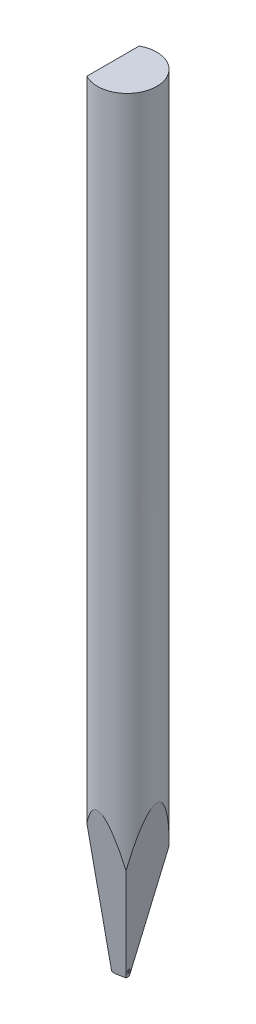
ISO-10303-21;
HEADER;
FILE_DESCRIPTION(('STEP AP214'),'2;1');
FILE_NAME('part.step','',(''),(''),'','','');
FILE_SCHEMA(('AUTOMOTIVE_DESIGN { 1 0 10303 214 1 1 1 1 }'));
ENDSEC;
DATA;
#1=APPLICATION_CONTEXT('core data for automotive mechanical design processes');
#2=APPLICATION_PROTOCOL_DEFINITION('international standard','automotive_design',2000,#1);
#3=PRODUCT_CONTEXT('',#1,'mechanical');
#4=PRODUCT('Part','Part','',(#3));
#5=PRODUCT_RELATED_PRODUCT_CATEGORY('part','',(#4));
#6=PRODUCT_DEFINITION_FORMATION('','',#4);
#7=PRODUCT_DEFINITION_CONTEXT('part definition',#1,'design');
#8=PRODUCT_DEFINITION('design','',#6,#7);
#9=PRODUCT_DEFINITION_SHAPE('','',#8);
#10=(LENGTH_UNIT() NAMED_UNIT(*) SI_UNIT(.MILLI.,.METRE.));
#11=(NAMED_UNIT(*) PLANE_ANGLE_UNIT() SI_UNIT($,.RADIAN.));
#12=(NAMED_UNIT(*) SI_UNIT($,.STERADIAN.) SOLID_ANGLE_UNIT());
#13=UNCERTAINTY_MEASURE_WITH_UNIT(LENGTH_MEASURE(1.E-05),#10,'distance_accuracy_value','');
#14=(GEOMETRIC_REPRESENTATION_CONTEXT(3) GLOBAL_UNCERTAINTY_ASSIGNED_CONTEXT((#13)) GLOBAL_UNIT_ASSIGNED_CONTEXT((#10,
#11,#12)) REPRESENTATION_CONTEXT('',''));
#15=CARTESIAN_POINT('',(0.,0.,0.));
#16=DIRECTION('',(0.,0.,1.));
#17=DIRECTION('',(1.,0.,0.));
#18=AXIS2_PLACEMENT_3D('',#15,#16,#17);
#19=CARTESIAN_POINT('',(26.8738719491216,0.,0.03556));
#20=DIRECTION('',(0.,-0.173648177666931,0.984807753012208));
#21=DIRECTION('',(0.,-0.984807753012208,-0.173648177666931));
#22=AXIS2_PLACEMENT_3D('',#19,#20,#21);
#23=PLANE('',#22);
#24=CARTESIAN_POINT('',(-0.35189,0.02413,0.039814770044496));
#25=DIRECTION('',(0.,-0.173648177666931,0.984807753012208));
#26=DIRECTION('',(0.,-0.984807753012208,-0.173648177666931));
#27=AXIS2_PLACEMENT_3D('',#24,#25,#26);
#28=ELLIPSE('',#27,0.024502244144803,0.02413);
#29=CARTESIAN_POINT('',(-0.351889999999997,0.,0.0355486570961342));
#30=VERTEX_POINT('',#29);
#31=CARTESIAN_POINT('',(-0.37592,0.0219354613240977,0.0394278136657258));
#32=VERTEX_POINT('',#31);
#33=EDGE_CURVE('E207',#30,#32,#28,.F.);
#34=ORIENTED_EDGE('',*,*,#33,.F.);
#35=CARTESIAN_POINT('',(-0.279400000000003,0.,0.0355373141922684));
#36=DIRECTION('',(-1.,0.,0.));
#37=VECTOR('',#36,1.);
#38=LINE('',#35,#37);
#39=CARTESIAN_POINT('',(-0.279399999999999,0.,0.0355486570961342));
#40=VERTEX_POINT('',#39);
#41=EDGE_CURVE('E234',#40,#30,#38,.T.);
#42=ORIENTED_EDGE('',*,*,#41,.F.);
#43=DIRECTION('',(-0.984346441568213,-0.173566836012845,-0.0306045161452665));
#44=VECTOR('',#43,1.);
#45=CARTESIAN_POINT('',(26.0304347628768,4.6391337266767,0.853564443127717));
#46=LINE('',#45,#44);
#47=CARTESIAN_POINT('',(0.0142086463569767,0.0517711261220242,0.0446886463569738));
#48=VERTEX_POINT('',#47);
#49=EDGE_CURVE('E277',#48,#40,#46,.T.);
#50=ORIENTED_EDGE('',*,*,#49,.F.);
#51=DIRECTION('',(-0.171087869746036,-0.970287525247814,-0.171087869746036));
#52=VECTOR('',#51,1.);
#53=CARTESIAN_POINT('',(0.791557999082992,4.46033837772866,0.822037999082991));
#54=LINE('',#53,#52);
#55=CARTESIAN_POINT('',(0.544920706940428,3.06158878676079,0.575400706940426));
#56=VERTEX_POINT('',#55);
#57=EDGE_CURVE('E274',#56,#48,#54,.T.);
#58=ORIENTED_EDGE('',*,*,#57,.F.);
#59=CARTESIAN_POINT('',(0.,-0.201670781505604,0.));
#60=DIRECTION('',(0.,-0.173648177666931,0.984807753012208));
#61=DIRECTION('',(0.,-0.984807753012208,-0.173648177666931));
#62=AXIS2_PLACEMENT_3D('',#59,#60,#61);
#63=ELLIPSE('',#62,4.56371043248163,0.792479999999998);
#64=CARTESIAN_POINT('',(-0.37592,3.75487126564512,0.69764511322018));
#65=VERTEX_POINT('',#64);
#66=EDGE_CURVE('E278',#56,#65,#63,.T.);
#67=ORIENTED_EDGE('',*,*,#66,.T.);
#68=DIRECTION('',(0.,0.984807753012208,0.173648177666931));
#69=VECTOR('',#68,1.);
#70=CARTESIAN_POINT('',(-0.37592,20.2537184461002,3.60683702172021));
#71=LINE('',#70,#69);
#72=EDGE_CURVE('E54',#32,#65,#71,.T.);
#73=ORIENTED_EDGE('',*,*,#72,.F.);
#74=EDGE_LOOP('',(#34,#42,#50,#58,#67,#73));
#75=FACE_BOUND('',#74,.T.);
#76=ADVANCED_FACE('F46',(#75),#23,.T.);
#77=CARTESIAN_POINT('',(26.8738719491216,0.,-0.03556));
#78=DIRECTION('',(0.,-0.173648177666931,-0.984807753012208));
#79=DIRECTION('',(0.,0.984807753012208,-0.173648177666931));
#80=AXIS2_PLACEMENT_3D('',#77,#78,#79);
#81=PLANE('',#80);
#82=CARTESIAN_POINT('',(-0.35189,0.02413,-0.039814770044496));
#83=DIRECTION('',(0.,-0.173648177666931,-0.984807753012208));
#84=DIRECTION('',(0.,0.984807753012208,-0.173648177666931));
#85=AXIS2_PLACEMENT_3D('',#82,#83,#84);
#86=ELLIPSE('',#85,0.024502244144803,0.02413);
#87=CARTESIAN_POINT('',(-0.37592,0.0219354613240977,-0.0394278136657258));
#88=VERTEX_POINT('',#87);
#89=CARTESIAN_POINT('',(-0.351890001163809,0.,-0.0355486570961342));
#90=VERTEX_POINT('',#89);
#91=EDGE_CURVE('E167',#88,#90,#86,.F.);
#92=ORIENTED_EDGE('',*,*,#91,.F.);
#93=DIRECTION('',(0.,-0.984807753012208,0.173648177666931));
#94=VECTOR('',#93,1.);
#95=CARTESIAN_POINT('',(-0.37592,20.5281827638758,-3.65523248618578));
#96=LINE('',#95,#94);
#97=CARTESIAN_POINT('',(-0.37592,3.75487126564511,-0.69764511322018));
#98=VERTEX_POINT('',#97);
#99=EDGE_CURVE('E162',#98,#88,#96,.T.);
#100=ORIENTED_EDGE('',*,*,#99,.F.);
#101=CARTESIAN_POINT('',(0.,-0.201670781505604,0.));
#102=DIRECTION('',(0.,-0.173648177666931,-0.984807753012208));
#103=DIRECTION('',(0.,-0.984807753012208,0.173648177666931));
#104=AXIS2_PLACEMENT_3D('',#101,#102,#103);
#105=ELLIPSE('',#104,4.56371043248163,0.792479999999998);
#106=CARTESIAN_POINT('',(0.544920706940428,3.06158878676079,-0.575400706940426));
#107=VERTEX_POINT('',#106);
#108=EDGE_CURVE('E281',#98,#107,#105,.T.);
#109=ORIENTED_EDGE('',*,*,#108,.T.);
#110=DIRECTION('',(0.171087869746036,0.970287525247814,-0.171087869746036));
#111=VECTOR('',#110,1.);
#112=CARTESIAN_POINT('',(0.791557999082992,4.46033837772866,-0.822037999082991));
#113=LINE('',#112,#111);
#114=CARTESIAN_POINT('',(0.0142086463569767,0.0517711261220242,-0.0446886463569738));
#115=VERTEX_POINT('',#114);
#116=EDGE_CURVE('E292',#115,#107,#113,.T.);
#117=ORIENTED_EDGE('',*,*,#116,.F.);
#118=DIRECTION('',(0.984346441568213,0.173566836012845,-0.0306045161452665));
#119=VECTOR('',#118,1.);
#120=CARTESIAN_POINT('',(26.0304347628768,4.6391337266767,-0.853564443127717));
#121=LINE('',#120,#119);
#122=CARTESIAN_POINT('',(-0.279399999999999,0.,-0.0355486570961342));
#123=VERTEX_POINT('',#122);
#124=EDGE_CURVE('E295',#123,#115,#121,.T.);
#125=ORIENTED_EDGE('',*,*,#124,.F.);
#126=CARTESIAN_POINT('',(-0.279399999999996,0.,-0.03556));
#127=DIRECTION('',(-1.,0.,0.));
#128=VECTOR('',#127,1.);
#129=LINE('',#126,#128);
#130=EDGE_CURVE('E229',#123,#90,#129,.T.);
#131=ORIENTED_EDGE('',*,*,#130,.T.);
#132=EDGE_LOOP('',(#92,#100,#109,#117,#125,#131));
#133=FACE_BOUND('',#132,.T.);
#134=ADVANCED_FACE('F315',(#133),#81,.T.);
#135=CARTESIAN_POINT('',(0.,21.0312,0.));
#136=DIRECTION('',(0.,-1.,0.));
#137=DIRECTION('',(0.,0.,-1.));
#138=AXIS2_PLACEMENT_3D('',#135,#136,#137);
#139=CYLINDRICAL_SURFACE('',#138,0.792479999999998);
#140=ORIENTED_EDGE('',*,*,#66,.F.);
#141=CARTESIAN_POINT('',(0.,-0.0288101116436568,0.));
#142=DIRECTION('',(-0.984807753012208,0.173648177666931,0.));
#143=DIRECTION('',(-0.173648177666931,-0.984807753012208,0.));
#144=AXIS2_PLACEMENT_3D('',#141,#142,#143);
#145=ELLIPSE('',#144,4.56371043248164,0.792479999999998);
#146=EDGE_CURVE('E271',#56,#107,#145,.T.);
#147=ORIENTED_EDGE('',*,*,#146,.T.);
#148=ORIENTED_EDGE('',*,*,#108,.F.);
#149=DIRECTION('',(0.,-1.,0.));
#150=VECTOR('',#149,1.);
#151=CARTESIAN_POINT('',(-0.37592,21.0312,-0.69764511322018));
#152=LINE('',#151,#150);
#153=CARTESIAN_POINT('',(-0.37592,21.0312,-0.69764511322018));
#154=VERTEX_POINT('',#153);
#155=EDGE_CURVE('E287',#154,#98,#152,.T.);
#156=ORIENTED_EDGE('',*,*,#155,.F.);
#157=CARTESIAN_POINT('',(0.,21.0312,0.));
#158=DIRECTION('',(0.,1.,0.));
#159=DIRECTION('',(0.,0.,1.));
#160=AXIS2_PLACEMENT_3D('',#157,#158,#159);
#161=CIRCLE('',#160,0.792479999999998);
#162=CARTESIAN_POINT('',(-0.37592,21.0312,0.69764511322018));
#163=VERTEX_POINT('',#162);
#164=EDGE_CURVE('E289',#163,#154,#161,.T.);
#165=ORIENTED_EDGE('',*,*,#164,.F.);
#166=DIRECTION('',(0.,-1.,0.));
#167=VECTOR('',#166,1.);
#168=CARTESIAN_POINT('',(-0.37592,21.0312,0.69764511322018));
#169=LINE('',#168,#167);
#170=EDGE_CURVE('E285',#65,#163,#169,.F.);
#171=ORIENTED_EDGE('',*,*,#170,.F.);
#172=EDGE_LOOP('',(#140,#147,#148,#156,#165,#171));
#173=FACE_BOUND('',#172,.T.);
#174=ADVANCED_FACE('F325',(#173),#139,.T.);
#175=CARTESIAN_POINT('',(-0.37592,21.0312,-0.80247998));
#176=DIRECTION('',(-1.,0.,0.));
#177=DIRECTION('',(0.,0.,1.));
#178=AXIS2_PLACEMENT_3D('',#175,#176,#177);
#179=PLANE('',#178);
#180=ORIENTED_EDGE('',*,*,#99,.T.);
#181=DIRECTION('',(0.,0.,-1.));
#182=VECTOR('',#181,1.);
#183=CARTESIAN_POINT('',(-0.37592,0.0219354613241028,27.1298665116056));
#184=LINE('',#183,#182);
#185=CARTESIAN_POINT('',(-0.375920000000275,0.0219355396613273,-0.0102248431803392));
#186=VERTEX_POINT('',#185);
#187=EDGE_CURVE('E159',#186,#88,#184,.T.);
#188=ORIENTED_EDGE('',*,*,#187,.F.);
#189=CARTESIAN_POINT('',(-0.37592,0.,0.0355373141922684));
#190=CARTESIAN_POINT('',(-0.37592,0.0123359586796348,0.0261254448351633));
#191=CARTESIAN_POINT('',(-0.37592,0.0241300000000007,0.013381408455424));
#192=CARTESIAN_POINT('',(-0.37592,0.0241300000000007,-0.0133814084554238));
#193=CARTESIAN_POINT('',(-0.37592,0.0123359586796344,-0.026125444835163));
#194=CARTESIAN_POINT('',(-0.37592,0.,-0.0355373141922685));
#195=(BOUNDED_CURVE() B_SPLINE_CURVE(3,(#189,#190,#191,#192,#193,#194),.UNSPECIFIED.,.F.,
.F.) B_SPLINE_CURVE_WITH_KNOTS((4,2,4),(1.35718974229686,1.5707963267949,1.78440291129293),
.UNSPECIFIED.) CURVE() GEOMETRIC_REPRESENTATION_ITEM() RATIONAL_B_SPLINE_CURVE((1.,1.,1.,1.,1.,1.)) REPRESENTATION_ITEM(''));
#196=CARTESIAN_POINT('',(-0.375959614183627,0.0231506993995764,0.0104909042535878));
#197=VERTEX_POINT('',#196);
#198=EDGE_CURVE('E149',#186,#197,#195,.F.);
#199=ORIENTED_EDGE('',*,*,#198,.T.);
#200=EDGE_CURVE('E69',#32,#197,#184,.T.);
#201=ORIENTED_EDGE('',*,*,#200,.F.);
#202=ORIENTED_EDGE('',*,*,#72,.T.);
#203=ORIENTED_EDGE('',*,*,#170,.T.);
#204=DIRECTION('',(0.,0.,-1.));
#205=VECTOR('',#204,1.);
#206=CARTESIAN_POINT('',(-0.37592,21.0312,-0.80247998));
#207=LINE('',#206,#205);
#208=EDGE_CURVE('E283',#163,#154,#207,.T.);
#209=ORIENTED_EDGE('',*,*,#208,.T.);
#210=ORIENTED_EDGE('',*,*,#155,.T.);
#211=EDGE_LOOP('',(#180,#188,#199,#201,#202,#203,#209,#210));
#212=FACE_BOUND('',#211,.T.);
#213=ADVANCED_FACE('F160',(#212),#179,.T.);
#214=CARTESIAN_POINT('',(0.,21.0312,0.));
#215=DIRECTION('',(0.,1.,0.));
#216=DIRECTION('',(0.,0.,1.));
#217=AXIS2_PLACEMENT_3D('',#214,#215,#216);
#218=PLANE('',#217);
#219=ORIENTED_EDGE('',*,*,#164,.T.);
#220=ORIENTED_EDGE('',*,*,#208,.F.);
#221=EDGE_LOOP('',(#219,#220));
#222=FACE_BOUND('',#221,.T.);
#223=ADVANCED_FACE('F331',(#222),#218,.T.);
#224=CARTESIAN_POINT('',(-0.2794,0.,27.2760283406468));
#225=DIRECTION('',(-0.173648177666931,0.984807753012208,0.));
#226=DIRECTION('',(-0.984807753012208,-0.173648177666931,0.));
#227=AXIS2_PLACEMENT_3D('',#224,#225,#226);
#228=PLANE('',#227);
#229=ORIENTED_EDGE('',*,*,#49,.T.);
#230=CARTESIAN_POINT('',(-1.20852610050796,-0.16383,0.));
#231=DIRECTION('',(-0.173648177666931,0.984807753012208,0.));
#232=DIRECTION('',(-0.984807753012208,-0.173648177666931,0.));
#233=AXIS2_PLACEMENT_3D('',#230,#231,#232);
#234=ELLIPSE('',#233,0.965400283794194,0.16764);
#235=CARTESIAN_POINT('',(-0.2666733614567,0.00224404974890385,0.0228599999999998));
#236=VERTEX_POINT('',#235);
#237=EDGE_CURVE('E240',#40,#236,#234,.T.);
#238=ORIENTED_EDGE('',*,*,#237,.T.);
#239=DIRECTION('',(-0.984807753012208,-0.173648177666931,0.));
#240=VECTOR('',#239,1.);
#241=CARTESIAN_POINT('',(-0.2794,0.,0.0228599999999995));
#242=LINE('',#241,#240);
#243=CARTESIAN_POINT('',(-0.1143,0.0291115845149677,0.0228599999999998));
#244=VERTEX_POINT('',#243);
#245=EDGE_CURVE('E303',#244,#236,#242,.T.);
#246=ORIENTED_EDGE('',*,*,#245,.F.);
#247=DIRECTION('',(0.,0.,1.));
#248=VECTOR('',#247,1.);
#249=CARTESIAN_POINT('',(-0.1143,0.0291115845149677,27.2760283406468));
#250=LINE('',#249,#248);
#251=CARTESIAN_POINT('',(-0.1143,0.0291115845149677,-0.0228599999999998));
#252=VERTEX_POINT('',#251);
#253=EDGE_CURVE('E301',#252,#244,#250,.T.);
#254=ORIENTED_EDGE('',*,*,#253,.F.);
#255=DIRECTION('',(-0.984807753012208,-0.173648177666931,0.));
#256=VECTOR('',#255,1.);
#257=CARTESIAN_POINT('',(-0.2794,0.,-0.0228599999999995));
#258=LINE('',#257,#256);
#259=CARTESIAN_POINT('',(-0.2666733614567,0.00224404974890385,-0.0228599999999998));
#260=VERTEX_POINT('',#259);
#261=EDGE_CURVE('E298',#252,#260,#258,.T.);
#262=ORIENTED_EDGE('',*,*,#261,.T.);
#263=EDGE_CURVE('E214',#260,#123,#234,.T.);
#264=ORIENTED_EDGE('',*,*,#263,.T.);
#265=ORIENTED_EDGE('',*,*,#124,.T.);
#266=DIRECTION('',(0.,0.,-1.));
#267=VECTOR('',#266,1.);
#268=CARTESIAN_POINT('',(0.0142086463569737,0.0517711261220249,27.2760283406468));
#269=LINE('',#268,#267);
#270=EDGE_CURVE('E268',#48,#115,#269,.T.);
#271=ORIENTED_EDGE('',*,*,#270,.F.);
#272=EDGE_LOOP('',(#229,#238,#246,#254,#262,#264,#265,#271));
#273=FACE_BOUND('',#272,.T.);
#274=ADVANCED_FACE('F532',(#273),#228,.F.);
#275=CARTESIAN_POINT('',(0.0142086463569737,0.0517711261220249,27.2760283406468));
#276=DIRECTION('',(-0.984807753012208,0.173648177666931,0.));
#277=DIRECTION('',(-0.173648177666931,-0.984807753012208,0.));
#278=AXIS2_PLACEMENT_3D('',#275,#276,#277);
#279=PLANE('',#278);
#280=CARTESIAN_POINT('',(0.0401727059586961,0.199020625304743,0.));
#281=DIRECTION('',(-0.984807753012208,0.173648177666931,0.));
#282=DIRECTION('',(0.173648177666931,0.984807753012208,0.));
#283=AXIS2_PLACEMENT_3D('',#280,#281,#282);
#284=ELLIPSE('',#283,0.0515734368592615,0.0370444608655554);
#285=CARTESIAN_POINT('',(0.0491283392853274,0.249810545773229,0.));
#286=VERTEX_POINT('',#285);
#287=EDGE_CURVE('E266',#286,#286,#284,.F.);
#288=ORIENTED_EDGE('',*,*,#287,.F.);
#289=EDGE_LOOP('',(#288));
#290=FACE_BOUND('',#289,.T.);
#291=ORIENTED_EDGE('',*,*,#146,.F.);
#292=ORIENTED_EDGE('',*,*,#57,.T.);
#293=ORIENTED_EDGE('',*,*,#270,.T.);
#294=ORIENTED_EDGE('',*,*,#116,.T.);
#295=EDGE_LOOP('',(#291,#292,#293,#294));
#296=FACE_BOUND('',#295,.T.);
#297=ADVANCED_FACE('F525',(#290,#296),#279,.F.);
#298=CARTESIAN_POINT('',(-0.224144167394209,0.0939800000000001,0.));
#299=DIRECTION('',(-0.500000000000004,-0.866025403784436,0.));
#300=DIRECTION('',(0.866025403784436,-0.500000000000004,0.));
#301=AXIS2_PLACEMENT_3D('',#298,#299,#300);
#302=CYLINDRICAL_SURFACE('',#301,0.02286);
#303=DIRECTION('',(-0.500000000000004,-0.866025403784436,0.));
#304=VECTOR('',#303,1.);
#305=CARTESIAN_POINT('',(-0.208802659269487,0.120552271536749,0.02286));
#306=LINE('',#305,#304);
#307=CARTESIAN_POINT('',(-0.224144167394209,0.0939800000000001,0.02286));
#308=VERTEX_POINT('',#307);
#309=CARTESIAN_POINT('',(-0.277107942966049,0.00224404974889894,0.02286));
#310=VERTEX_POINT('',#309);
#311=EDGE_CURVE('E260',#308,#310,#306,.T.);
#312=ORIENTED_EDGE('',*,*,#311,.T.);
#313=CARTESIAN_POINT('',(-0.277107942966052,0.00224404974889966,-0.02286));
#314=CARTESIAN_POINT('',(-0.283458830952595,0.00662990732762152,-0.022859999999999));
#315=CARTESIAN_POINT('',(-0.288238014169759,0.00906804178727436,-0.0196229390810593));
#316=CARTESIAN_POINT('',(-0.295009573337047,0.0127605615105413,-0.011151028810743));
#317=CARTESIAN_POINT('',(-0.296750516375033,0.0139697273321268,-0.00556059566064805));
#318=CARTESIAN_POINT('',(-0.296718155170427,0.0139702741342318,0.0056735396289807));
#319=CARTESIAN_POINT('',(-0.294957682369533,0.0127624560377921,0.0112285482507281));
#320=CARTESIAN_POINT('',(-0.288162967316092,0.00907275932146746,0.0196621664995063));
#321=CARTESIAN_POINT('',(-0.283434228325602,0.00661851153547161,0.0228599999999999));
#322=CARTESIAN_POINT('',(-0.277107942966049,0.00224404974889968,0.02286));
#323=(BOUNDED_CURVE() B_SPLINE_CURVE(3,(#313,#314,#315,#316,#317,#318,#319,#320,#321,#322),
.UNSPECIFIED.,.F.,.F.) B_SPLINE_CURVE_WITH_KNOTS((4,2,2,2,4),(0.,1.89475864318584E-05,
3.78951728637168E-05,5.68427592955753E-05,7.57903457274337E-05),
.UNSPECIFIED.) CURVE() GEOMETRIC_REPRESENTATION_ITEM() RATIONAL_B_SPLINE_CURVE((1.,1.,1.,1.,1.,
1.,1.,1.,1.,1.)) REPRESENTATION_ITEM(''));
#324=CARTESIAN_POINT('',(-0.277107942966048,0.0022440497488995,-0.02286));
#325=VERTEX_POINT('',#324);
#326=EDGE_CURVE('E358',#310,#325,#323,.F.);
#327=ORIENTED_EDGE('',*,*,#326,.T.);
#328=DIRECTION('',(0.500000000000004,0.866025403784436,0.));
#329=VECTOR('',#328,1.);
#330=CARTESIAN_POINT('',(-0.224144167394209,0.0939800000000001,-0.02286));
#331=LINE('',#330,#329);
#332=CARTESIAN_POINT('',(-0.224144167394209,0.0939800000000001,-0.02286));
#333=VERTEX_POINT('',#332);
#334=EDGE_CURVE('E267',#325,#333,#331,.T.);
#335=ORIENTED_EDGE('',*,*,#334,.T.);
#336=CARTESIAN_POINT('',(-0.224144167394209,0.0939800000000001,0.));
#337=DIRECTION('',(0.,-1.,0.));
#338=DIRECTION('',(-1.,0.,0.));
#339=AXIS2_PLACEMENT_3D('',#336,#337,#338);
#340=ELLIPSE('',#339,0.0263964543073498,0.02286);
#341=EDGE_CURVE('E264',#333,#308,#340,.F.);
#342=ORIENTED_EDGE('',*,*,#341,.T.);
#343=EDGE_LOOP('',(#312,#327,#335,#342));
#344=FACE_BOUND('',#343,.T.);
#345=ADVANCED_FACE('F518',(#344),#302,.F.);
#346=CARTESIAN_POINT('',(-0.1143,0.0939800000000001,0.02286));
#347=DIRECTION('',(-1.,0.,0.));
#348=DIRECTION('',(0.,0.,1.));
#349=AXIS2_PLACEMENT_3D('',#346,#347,#348);
#350=PLANE('',#349);
#351=ORIENTED_EDGE('',*,*,#253,.T.);
#352=DIRECTION('',(0.,1.,0.));
#353=VECTOR('',#352,1.);
#354=CARTESIAN_POINT('',(-0.1143,0.0939800000000001,0.02286));
#355=LINE('',#354,#353);
#356=CARTESIAN_POINT('',(-0.1143,0.0939800000000001,0.02286));
#357=VERTEX_POINT('',#356);
#358=EDGE_CURVE('E257',#244,#357,#355,.T.);
#359=ORIENTED_EDGE('',*,*,#358,.T.);
#360=CARTESIAN_POINT('',(-0.1143,0.09398,0.));
#361=DIRECTION('',(1.,0.,0.));
#362=DIRECTION('',(0.,1.,0.));
#363=AXIS2_PLACEMENT_3D('',#360,#361,#362);
#364=ELLIPSE('',#363,0.0263964543073496,0.02286);
#365=CARTESIAN_POINT('',(-0.1143,0.0939800000000001,-0.0228599999999995));
#366=VERTEX_POINT('',#365);
#367=EDGE_CURVE('E250',#366,#357,#364,.F.);
#368=ORIENTED_EDGE('',*,*,#367,.F.);
#369=DIRECTION('',(0.,1.,0.));
#370=VECTOR('',#369,1.);
#371=CARTESIAN_POINT('',(-0.1143,0.0939800000000001,-0.02286));
#372=LINE('',#371,#370);
#373=EDGE_CURVE('E258',#252,#366,#372,.T.);
#374=ORIENTED_EDGE('',*,*,#373,.F.);
#375=EDGE_LOOP('',(#351,#359,#368,#374));
#376=FACE_BOUND('',#375,.T.);
#377=ADVANCED_FACE('F509',(#376),#350,.T.);
#378=CARTESIAN_POINT('',(0.,0.,0.02286));
#379=DIRECTION('',(0.,0.,-1.));
#380=DIRECTION('',(-1.,0.,0.));
#381=AXIS2_PLACEMENT_3D('',#378,#379,#380);
#382=PLANE('',#381);
#383=DIRECTION('',(-1.,0.,0.));
#384=VECTOR('',#383,1.);
#385=CARTESIAN_POINT('',(26.7532219491216,0.00224404974889968,0.02286));
#386=LINE('',#385,#384);
#387=EDGE_CURVE('E237',#310,#236,#386,.F.);
#388=ORIENTED_EDGE('',*,*,#387,.F.);
#389=ORIENTED_EDGE('',*,*,#311,.F.);
#390=DIRECTION('',(-1.,0.,0.));
#391=VECTOR('',#390,1.);
#392=CARTESIAN_POINT('',(-0.250540621701558,0.0939800000000001,0.02286));
#393=LINE('',#392,#391);
#394=EDGE_CURVE('E254',#357,#308,#393,.T.);
#395=ORIENTED_EDGE('',*,*,#394,.F.);
#396=ORIENTED_EDGE('',*,*,#358,.F.);
#397=ORIENTED_EDGE('',*,*,#245,.T.);
#398=EDGE_LOOP('',(#388,#389,#395,#396,#397));
#399=FACE_BOUND('',#398,.T.);
#400=ADVANCED_FACE('F503',(#399),#382,.T.);
#401=CARTESIAN_POINT('',(0.,0.,-0.02286));
#402=DIRECTION('',(0.,0.,-1.));
#403=DIRECTION('',(-1.,0.,0.));
#404=AXIS2_PLACEMENT_3D('',#401,#402,#403);
#405=PLANE('',#404);
#406=ORIENTED_EDGE('',*,*,#334,.F.);
#407=DIRECTION('',(-1.,0.,0.));
#408=VECTOR('',#407,1.);
#409=CARTESIAN_POINT('',(26.7532219491216,0.00224404974889968,-0.02286));
#410=LINE('',#409,#408);
#411=EDGE_CURVE('E306',#325,#260,#410,.F.);
#412=ORIENTED_EDGE('',*,*,#411,.T.);
#413=ORIENTED_EDGE('',*,*,#261,.F.);
#414=ORIENTED_EDGE('',*,*,#373,.T.);
#415=DIRECTION('',(-1.,0.,0.));
#416=VECTOR('',#415,1.);
#417=CARTESIAN_POINT('',(-0.250540621701558,0.0939800000000001,-0.02286));
#418=LINE('',#417,#416);
#419=EDGE_CURVE('E253',#366,#333,#418,.T.);
#420=ORIENTED_EDGE('',*,*,#419,.T.);
#421=EDGE_LOOP('',(#406,#412,#413,#414,#420));
#422=FACE_BOUND('',#421,.T.);
#423=ADVANCED_FACE('F497',(#422),#405,.F.);
#424=CARTESIAN_POINT('',(0.0122322627883964,0.167033435982052,0.));
#425=DIRECTION('',(0.866025403784441,0.499999999999995,0.));
#426=DIRECTION('',(-0.499999999999995,0.866025403784441,0.));
#427=AXIS2_PLACEMENT_3D('',#424,#425,#426);
#428=CONICAL_SURFACE('',#427,0.02286,0.392699081698725);
#429=CARTESIAN_POINT('',(0.0122322627883964,0.167033435982052,0.));
#430=DIRECTION('',(0.866025403784441,0.499999999999995,0.));
#431=DIRECTION('',(-0.499999999999995,0.866025403784441,0.));
#432=AXIS2_PLACEMENT_3D('',#429,#430,#431);
#433=CIRCLE('',#432,0.02286);
#434=CARTESIAN_POINT('',(0.00080226278839655,0.186830776712565,0.));
#435=VERTEX_POINT('',#434);
#436=EDGE_CURVE('E244',#435,#435,#433,.T.);
#437=ORIENTED_EDGE('',*,*,#436,.F.);
#438=EDGE_LOOP('',(#437));
#439=FACE_BOUND('',#438,.T.);
#440=ORIENTED_EDGE('',*,*,#287,.T.);
#441=EDGE_LOOP('',(#440));
#442=FACE_BOUND('',#441,.T.);
#443=ADVANCED_FACE('F490',(#439,#442),#428,.F.);
#444=CARTESIAN_POINT('',(-0.250540621701558,0.0939800000000001,0.02286));
#445=DIRECTION('',(0.,-1.,0.));
#446=DIRECTION('',(0.,0.,-1.));
#447=AXIS2_PLACEMENT_3D('',#444,#445,#446);
#448=PLANE('',#447);
#449=ORIENTED_EDGE('',*,*,#419,.F.);
#450=CARTESIAN_POINT('',(-0.1143,0.0939800000000001,0.));
#451=DIRECTION('',(0.,1.,0.));
#452=DIRECTION('',(1.,0.,0.));
#453=AXIS2_PLACEMENT_3D('',#450,#451,#452);
#454=ELLIPSE('',#453,0.0457200000000004,0.02286);
#455=EDGE_CURVE('E247',#357,#366,#454,.F.);
#456=ORIENTED_EDGE('',*,*,#455,.F.);
#457=ORIENTED_EDGE('',*,*,#394,.T.);
#458=ORIENTED_EDGE('',*,*,#341,.F.);
#459=EDGE_LOOP('',(#449,#456,#457,#458));
#460=FACE_BOUND('',#459,.T.);
#461=ADVANCED_FACE('F483',(#460),#448,.T.);
#462=CARTESIAN_POINT('',(-0.361071138175361,-0.0484933830537733,0.));
#463=DIRECTION('',(0.866025403784441,0.499999999999995,0.));
#464=DIRECTION('',(-0.499999999999995,0.866025403784441,0.));
#465=AXIS2_PLACEMENT_3D('',#462,#463,#464);
#466=CYLINDRICAL_SURFACE('',#465,0.02286);
#467=ORIENTED_EDGE('',*,*,#367,.T.);
#468=ORIENTED_EDGE('',*,*,#455,.T.);
#469=EDGE_LOOP('',(#467,#468));
#470=FACE_BOUND('',#469,.T.);
#471=ORIENTED_EDGE('',*,*,#436,.T.);
#472=EDGE_LOOP('',(#471));
#473=FACE_BOUND('',#472,.T.);
#474=ADVANCED_FACE('F476',(#470,#473),#466,.F.);
#475=CARTESIAN_POINT('',(26.7532219491216,-0.16383,0.));
#476=DIRECTION('',(-1.,0.,0.));
#477=DIRECTION('',(0.,0.,1.));
#478=AXIS2_PLACEMENT_3D('',#475,#476,#477);
#479=CYLINDRICAL_SURFACE('',#478,0.16764);
#480=ORIENTED_EDGE('',*,*,#41,.T.);
#481=CARTESIAN_POINT('',(-0.35189,0.,0.0355373141922683));
#482=CARTESIAN_POINT('',(-0.352249668342652,-3.16449690722576E-07,0.0355385995095472));
#483=CARTESIAN_POINT('',(-0.352607439601552,8.02818367779302E-06,0.035500318254268));
#484=CARTESIAN_POINT('',(-0.353303655703915,3.90463941921333E-05,0.035356943948664));
#485=CARTESIAN_POINT('',(-0.35364230350704,6.15137569732016E-05,0.0352528122895421));
#486=CARTESIAN_POINT('',(-0.354293614243821,0.000117763185050422,0.0349902438494602));
#487=CARTESIAN_POINT('',(-0.354606422572584,0.000151475665794155,0.0348321409041788));
#488=CARTESIAN_POINT('',(-0.355206981302933,0.000227153868779389,0.0344739623195258));
#489=CARTESIAN_POINT('',(-0.355494629178865,0.000269151278077548,0.0342737253292833));
#490=CARTESIAN_POINT('',(-0.356269110683656,0.000395250314370262,0.0336659216504495));
#491=CARTESIAN_POINT('',(-0.356726660395172,0.00048571662512432,0.0332226300592557));
#492=CARTESIAN_POINT('',(-0.357571422670495,0.000674415716682483,0.0322754539317033));
#493=CARTESIAN_POINT('',(-0.357958419343304,0.000772671057964609,0.0317713910024871));
#494=CARTESIAN_POINT('',(-0.359056529172293,0.00107580067057373,0.0301733027579171));
#495=CARTESIAN_POINT('',(-0.359677833698042,0.00128358971704938,0.0290188780669949));
#496=CARTESIAN_POINT('',(-0.360765248765371,0.00168436492621815,0.0266393127268898));
#497=CARTESIAN_POINT('',(-0.361230981402633,0.00187731417930491,0.0254140082426788));
#498=CARTESIAN_POINT('',(-0.362621271092901,0.00248985705969521,0.0212073753235815));
#499=CARTESIAN_POINT('',(-0.363292499871965,0.00285492843747613,0.0181353476659175));
#500=CARTESIAN_POINT('',(-0.364276679349104,0.00341576574656531,0.011914135200334));
#501=CARTESIAN_POINT('',(-0.364587661352636,0.00361059994835119,0.00876462159407559));
#502=CARTESIAN_POINT('',(-0.365008078841964,0.00387434920441835,0.000878520987402362));
#503=CARTESIAN_POINT('',(-0.364941234586347,0.00383299736486934,-0.00387100770454569));
#504=CARTESIAN_POINT('',(-0.364167431319614,0.00334801222560689,-0.0132807766904793));
#505=CARTESIAN_POINT('',(-0.363466026079495,0.00290786915558577,-0.0179414340866815));
#506=CARTESIAN_POINT('',(-0.36193592566994,0.00218943506644065,-0.0232698617756447));
#507=CARTESIAN_POINT('',(-0.361669336734853,0.00206830252842661,-0.0241173628313132));
#508=CARTESIAN_POINT('',(-0.361079500183911,0.00181590566570129,-0.0257937219689848));
#509=CARTESIAN_POINT('',(-0.360756111149156,0.00168461652098862,-0.0266225275511691));
#510=CARTESIAN_POINT('',(-0.35998579927833,0.00139436321865013,-0.0283722163485437));
#511=CARTESIAN_POINT('',(-0.359527578320929,0.001234222180734,-0.0292879935258525));
#512=CARTESIAN_POINT('',(-0.358486460226345,0.000912657788249072,-0.0310452521132942));
#513=CARTESIAN_POINT('',(-0.357904183819938,0.000751244535882227,-0.0318870749858191));
#514=CARTESIAN_POINT('',(-0.356960612388886,0.000537175877260391,-0.0329652175868376));
#515=CARTESIAN_POINT('',(-0.356673376179319,0.000476848448842925,-0.0332642866227059));
#516=CARTESIAN_POINT('',(-0.356064305294946,0.000361768756806117,-0.0338277165810827));
#517=CARTESIAN_POINT('',(-0.355742427249449,0.000307023653008031,-0.0340920330529973));
#518=CARTESIAN_POINT('',(-0.355056183372289,0.000206073174392503,-0.0345745305900019));
#519=CARTESIAN_POINT('',(-0.354691240587476,0.000160011974018906,-0.0347919401869181));
#520=CARTESIAN_POINT('',(-0.353925793078151,8.30042228159718E-05,-0.0351529694942782));
#521=CARTESIAN_POINT('',(-0.35352549751998,5.19749993899303E-05,-0.0352969930442583));
#522=CARTESIAN_POINT('',(-0.35291414394059,2.09077143094358E-05,-0.0354408230247105));
#523=CARTESIAN_POINT('',(-0.352711684747334,1.31384500590742E-05,-0.0354767046674955));
#524=CARTESIAN_POINT('',(-0.352302905346337,2.65576819388359E-06,-0.0355250720129181));
#525=CARTESIAN_POINT('',(-0.352096571370407,-3.34685002849045E-08,-0.0355374458198908));
#526=CARTESIAN_POINT('',(-0.351890000000659,-1.69126212556192E-13,-0.0355373141950321));
#527=B_SPLINE_CURVE_WITH_KNOTS('',3,(#481,#482,#483,#484,#485,#486,#487,#488,#489,#490,#491,
#492,#493,#494,#495,#496,#497,#498,#499,#500,#501,#502,#503,#504,#505,#506,#507,#508,#509,#510,
#511,#512,#513,#514,#515,#516,#517,#518,#519,#520,#521,#522,#523,#524,#525,#526),.UNSPECIFIED.,
.F.,.F.,(4,2,2,2,2,2,2,2,2,2,2,2,2,2,2,2,2,2,2,2,2,2,4),(0.,0.00107387793307657,
0.00213242859854211,0.00318454687300331,0.00424077001276026,0.00615999330151539,
0.00808499425946021,0.0120448307551717,0.0160142174212496,0.0254592668811041,0.0349556921836128,
0.0491587337563668,0.0632386581819677,0.0659271174774072,0.0686223678254562,0.0717265046140481,
0.0748154595966133,0.0760704044702135,0.077326939193447,0.0786027851340041,0.079871532210631,
0.080487513455096,0.0811064194522882),.UNSPECIFIED.);
#528=CARTESIAN_POINT('',(-0.362934641039202,0.0026873631636297,0.0193619822582397));
#529=VERTEX_POINT('',#528);
#530=EDGE_CURVE('E166',#30,#529,#527,.T.);
#531=ORIENTED_EDGE('',*,*,#530,.T.);
#532=CARTESIAN_POINT('',(-0.37592,0.,-0.0355373141922685));
#533=CARTESIAN_POINT('',(-0.365756940225437,0.00252981156072762,-0.0238746706466237));
#534=CARTESIAN_POINT('',(-0.355600000000001,0.00381000000000001,-0.0119362651530878));
#535=CARTESIAN_POINT('',(-0.355600000000001,0.00381,0.0119362651530881));
#536=CARTESIAN_POINT('',(-0.365756940225437,0.00252981156072763,0.0238746706466237));
#537=CARTESIAN_POINT('',(-0.37592,0.,0.0355373141922684));
#538=(BOUNDED_CURVE() B_SPLINE_CURVE(3,(#532,#533,#534,#535,#536,#537),.UNSPECIFIED.,.F.,
.F.) B_SPLINE_CURVE_WITH_KNOTS((4,2,4),(1.35718974229686,1.5707963267949,1.78440291129293),
.UNSPECIFIED.) CURVE() GEOMETRIC_REPRESENTATION_ITEM() RATIONAL_B_SPLINE_CURVE((1.,1.,1.,1.,1.,1.)) REPRESENTATION_ITEM(''));
#539=CARTESIAN_POINT('',(-0.362934637535101,0.00268735671838067,-0.0193620377734101));
#540=VERTEX_POINT('',#539);
#541=EDGE_CURVE('E155',#529,#540,#538,.F.);
#542=ORIENTED_EDGE('',*,*,#541,.T.);
#543=EDGE_CURVE('E171',#540,#90,#527,.T.);
#544=ORIENTED_EDGE('',*,*,#543,.T.);
#545=ORIENTED_EDGE('',*,*,#130,.F.);
#546=ORIENTED_EDGE('',*,*,#263,.F.);
#547=ORIENTED_EDGE('',*,*,#411,.F.);
#548=CARTESIAN_POINT('',(-0.277107942966049,0.00224404974889968,0.02286));
#549=CARTESIAN_POINT('',(-0.283472069272186,0.0016442867352262,0.0272171772777935));
#550=CARTESIAN_POINT('',(-0.292608347157434,0.0016234757173974,0.0273466306211965));
#551=CARTESIAN_POINT('',(-0.308350693361825,0.00283426151014642,0.0185934065888038));
#552=CARTESIAN_POINT('',(-0.314304668214107,0.00380460465811883,0.00955459901852536));
#553=CARTESIAN_POINT('',(-0.31435916834997,0.00381534135033899,-0.00936432404484779));
#554=CARTESIAN_POINT('',(-0.308433634839991,0.00284880217824659,-0.0184711274946257));
#555=CARTESIAN_POINT('',(-0.292708773944077,0.0016329051680215,-0.0272952864036251));
#556=CARTESIAN_POINT('',(-0.283500112457096,0.0016422284077341,-0.0272321306803446));
#557=CARTESIAN_POINT('',(-0.277107942966052,0.00224404974889966,-0.02286));
#558=(BOUNDED_CURVE() B_SPLINE_CURVE(3,(#548,#549,#550,#551,#552,#553,#554,#555,#556,#557),
.UNSPECIFIED.,.F.,.F.) B_SPLINE_CURVE_WITH_KNOTS((4,2,2,2,4),(0.,1.89475864318584E-05,
3.78951728637168E-05,5.68427592955753E-05,7.57903457274337E-05),
.UNSPECIFIED.) CURVE() GEOMETRIC_REPRESENTATION_ITEM() RATIONAL_B_SPLINE_CURVE((1.,1.,1.,1.,1.,
1.,1.,1.,1.,1.)) REPRESENTATION_ITEM(''));
#559=EDGE_CURVE('E357',#325,#310,#558,.F.);
#560=ORIENTED_EDGE('',*,*,#559,.T.);
#561=ORIENTED_EDGE('',*,*,#387,.T.);
#562=ORIENTED_EDGE('',*,*,#237,.F.);
#563=EDGE_LOOP('',(#480,#531,#542,#544,#545,#546,#547,#560,#561,#562));
#564=FACE_BOUND('',#563,.T.);
#565=ADVANCED_FACE('F183',(#564),#479,.F.);
#566=CARTESIAN_POINT('',(-0.277107942966049,0.00224404974889968,0.02286));
#567=CARTESIAN_POINT('',(-0.283434228325602,0.00661851153547161,0.0228599999999999));
#568=CARTESIAN_POINT('',(-0.288162967316092,0.00907275932146746,0.0196621664995063));
#569=CARTESIAN_POINT('',(-0.294957682369533,0.0127624560377921,0.0112285482507281));
#570=CARTESIAN_POINT('',(-0.296718155170427,0.0139702741342318,0.0056735396289807));
#571=CARTESIAN_POINT('',(-0.296750516375033,0.0139697273321268,-0.00556059566064805));
#572=CARTESIAN_POINT('',(-0.295009573337047,0.0127605615105413,-0.011151028810743));
#573=CARTESIAN_POINT('',(-0.288238014169759,0.00906804178727436,-0.0196229390810593));
#574=CARTESIAN_POINT('',(-0.283458830952595,0.00662990732762152,-0.022859999999999));
#575=CARTESIAN_POINT('',(-0.277107942966052,0.00224404974889966,-0.02286));
#576=CARTESIAN_POINT('',(-0.277107942966049,0.00224404974889968,0.02286));
#577=CARTESIAN_POINT('',(-0.282799904250856,0.00224508121370906,0.0228596717317687));
#578=CARTESIAN_POINT('',(-0.289309195326958,0.00262640016305242,0.0212566041515952));
#579=CARTESIAN_POINT('',(-0.299268415177658,0.00344454680683125,0.0130540565646547));
#580=CARTESIAN_POINT('',(-0.30257985893891,0.00380792934344847,0.00658152497028285));
#581=CARTESIAN_POINT('',(-0.302620530520814,0.00381205022825936,-0.00645031113070643));
#582=CARTESIAN_POINT('',(-0.299333051151248,0.00345069171773801,-0.0129671346731368));
#583=CARTESIAN_POINT('',(-0.289394582117606,0.00263120354491061,-0.0212193327036071));
#584=CARTESIAN_POINT('',(-0.282825806150449,0.00224499062083318,-0.0228603688544052));
#585=CARTESIAN_POINT('',(-0.277107942966052,0.00224404974889966,-0.02286));
#586=CARTESIAN_POINT('',(-0.277107942966049,0.00224404974889968,0.02286));
#587=CARTESIAN_POINT('',(-0.283472069272186,0.0016442867352262,0.0272171772777935));
#588=CARTESIAN_POINT('',(-0.292608347157434,0.0016234757173974,0.0273466306211965));
#589=CARTESIAN_POINT('',(-0.308350693361825,0.00283426151014642,0.0185934065888038));
#590=CARTESIAN_POINT('',(-0.314304668214107,0.00380460465811883,0.00955459901852536));
#591=CARTESIAN_POINT('',(-0.31435916834997,0.00381534135033899,-0.00936432404484779));
#592=CARTESIAN_POINT('',(-0.308433634839991,0.00284880217824659,-0.0184711274946257));
#593=CARTESIAN_POINT('',(-0.292708773944077,0.0016329051680215,-0.0272952864036251));
#594=CARTESIAN_POINT('',(-0.283500112457096,0.0016422284077341,-0.0272321306803446));
#595=CARTESIAN_POINT('',(-0.277107942966052,0.00224404974889966,-0.02286));
#596=(BOUNDED_SURFACE() B_SPLINE_SURFACE(2,3,((#566,#567,#568,#569,#570,#571,#572,#573,#574,
#575),(#576,#577,#578,#579,#580,#581,#582,#583,#584,#585),(#586,#587,#588,#589,#590,#591,#592,
#593,#594,#595)),.UNSPECIFIED.,.F.,.F.,.F.) B_SPLINE_SURFACE_WITH_KNOTS((3,3),(4,2,2,2,4),(0.,
1.),(0.,1.89475864318584E-05,3.78951728637168E-05,5.68427592955753E-05,7.57903457274337E-05),
.UNSPECIFIED.) GEOMETRIC_REPRESENTATION_ITEM() RATIONAL_B_SPLINE_SURFACE(((1.,1.,1.,1.,1.,1.,1.,
1.,1.,1.),(0.753778361444412,0.816999421397932,0.841371347447862,0.866090023191699,
0.866013332606022,0.866037357056243,0.866147684701979,0.841596576328909,0.817236348950093,
0.753778361444431),(1.,1.,1.,1.,1.,1.,1.,1.,1.,1.))) REPRESENTATION_ITEM('') SURFACE());
#597=ORIENTED_EDGE('',*,*,#326,.F.);
#598=ORIENTED_EDGE('',*,*,#559,.F.);
#599=EDGE_LOOP('',(#597,#598));
#600=FACE_BOUND('',#599,.T.);
#601=ADVANCED_FACE('F394',(#600),#596,.T.);
#602=CARTESIAN_POINT('',(-0.37592,0.,0.0355373141922684));
#603=CARTESIAN_POINT('',(-0.365756940225437,0.00252981156072763,0.0238746706466237));
#604=CARTESIAN_POINT('',(-0.355600000000001,0.00381,0.0119362651530881));
#605=CARTESIAN_POINT('',(-0.355600000000001,0.00381000000000001,-0.0119362651530878));
#606=CARTESIAN_POINT('',(-0.365756940225437,0.00252981156072762,-0.0238746706466237));
#607=CARTESIAN_POINT('',(-0.37592,0.,-0.0355373141922685));
#608=CARTESIAN_POINT('',(-0.37592,0.,0.0355373141922684));
#609=CARTESIAN_POINT('',(-0.375919999999993,0.00253036332383113,0.0238721239843854));
#610=CARTESIAN_POINT('',(-0.375920000000001,0.00381000000000123,0.0119362651530879));
#611=CARTESIAN_POINT('',(-0.375920000000001,0.00381000000000106,-0.0119362651530877));
#612=CARTESIAN_POINT('',(-0.375919999999994,0.00253036332383165,-0.0238721239843857));
#613=CARTESIAN_POINT('',(-0.37592,0.,-0.0355373141922685));
#614=CARTESIAN_POINT('',(-0.37592,0.,0.0355373141922684));
#615=CARTESIAN_POINT('',(-0.37592,0.0123359586796348,0.0261254448351633));
#616=CARTESIAN_POINT('',(-0.37592,0.0241300000000007,0.013381408455424));
#617=CARTESIAN_POINT('',(-0.37592,0.0241300000000007,-0.0133814084554238));
#618=CARTESIAN_POINT('',(-0.37592,0.0123359586796344,-0.026125444835163));
#619=CARTESIAN_POINT('',(-0.37592,0.,-0.0355373141922685));
#620=(BOUNDED_SURFACE() B_SPLINE_SURFACE(2,3,((#602,#603,#604,#605,#606,#607),(#608,#609,#610,
#611,#612,#613),(#614,#615,#616,#617,#618,#619)),.UNSPECIFIED.,.F.,.F.,
.F.) B_SPLINE_SURFACE_WITH_KNOTS((3,3),(4,2,4),(0.,1.),(1.35718974229686,1.5707963267949,
1.78440291129293),.UNSPECIFIED.) GEOMETRIC_REPRESENTATION_ITEM() RATIONAL_B_SPLINE_SURFACE(((1.,
1.,1.,1.,1.,1.),(0.707106781186548,0.707106781186548,0.707106781186556,0.707106781186556,
0.707106781186548,0.707106781186548),(1.,1.,1.,1.,1.,1.))) REPRESENTATION_ITEM('') SURFACE());
#621=CARTESIAN_POINT('',(-0.375920000000007,0.0219354613242672,0.0102620121258682));
#622=CARTESIAN_POINT('',(-0.375919489550987,0.0219291894204861,0.0099803782721847));
#623=CARTESIAN_POINT('',(-0.375918753370209,0.021921012819528,0.00970061206674253));
#624=CARTESIAN_POINT('',(-0.375913665284554,0.0218677362793535,0.0091187410662757));
#625=CARTESIAN_POINT('',(-0.375908975824181,0.0218191952353393,0.00881704526415965));
#626=CARTESIAN_POINT('',(-0.37588428971533,0.0215639524164697,0.00796333042616949));
#627=CARTESIAN_POINT('',(-0.375854631576575,0.0212574877507745,0.00741790355266603));
#628=CARTESIAN_POINT('',(-0.375719817658285,0.0203165609400982,0.00671918309249352));
#629=CARTESIAN_POINT('',(-0.375607518839698,0.0196527864488367,0.0066097654257927));
#630=CARTESIAN_POINT('',(-0.37535161008681,0.0184512745318179,0.00659307822304746));
#631=CARTESIAN_POINT('',(-0.37521144719452,0.0179076266522268,0.00666951059019875));
#632=CARTESIAN_POINT('',(-0.37489812112059,0.0168394282465482,0.0068755408553275));
#633=CARTESIAN_POINT('',(-0.374725395377578,0.0163147234947038,0.00700445766411951));
#634=CARTESIAN_POINT('',(-0.373684118460407,0.0134760005174531,0.00778122590523593));
#635=CARTESIAN_POINT('',(-0.372501713377624,0.0113477211841347,0.00866190010271208));
#636=CARTESIAN_POINT('',(-0.369559270681575,0.00752578259821198,0.0107691619999054));
#637=CARTESIAN_POINT('',(-0.367774439441708,0.00585760242522171,0.0120102070298527));
#638=CARTESIAN_POINT('',(-0.365373620285018,0.00409419127710806,0.0145695354624093));
#639=CARTESIAN_POINT('',(-0.364643630530053,0.0036350411509129,0.0154903952704211));
#640=CARTESIAN_POINT('',(-0.363564314702591,0.00300394857614872,0.0173977741703559));
#641=CARTESIAN_POINT('',(-0.36317293859052,0.00279796747436655,0.0183506228850656));
#642=CARTESIAN_POINT('',(-0.36295018680107,0.00268404075529754,0.0193884040138287));
#643=B_SPLINE_CURVE_WITH_KNOTS('',3,(#621,#622,#623,#624,#625,#626,#627,#628,#629,#630,#631,
#632,#633,#634,#635,#636,#637,#638,#639,#640,#641,#642),.UNSPECIFIED.,.F.,.F.,(4,2,2,2,2,2,2,2,
2,2,4),(0.,0.000840070868181347,0.00176011904497301,0.00346705553043279,0.00534198489935762,
0.00705850469313748,0.00875342534292719,0.0163991404279679,0.0244084194658276,
0.0281277042559056,0.0312561386344815),.UNSPECIFIED.);
#644=EDGE_CURVE('E12',#197,#529,#643,.T.);
#645=CARTESIAN_POINT('',(-0.362950186800526,0.00268404075502565,-0.0193884040161041));
#646=CARTESIAN_POINT('',(-0.363178503286617,0.00279899348610523,-0.0183331327703365));
#647=CARTESIAN_POINT('',(-0.363577759859133,0.00300999845553816,-0.0173667359227687));
#648=CARTESIAN_POINT('',(-0.364731817147154,0.00368894630919354,-0.0153434645724516));
#649=CARTESIAN_POINT('',(-0.365556583424588,0.00421413085485259,-0.0143433069387353));
#650=CARTESIAN_POINT('',(-0.36775558476807,0.00587208630201419,-0.0121039949582569));
#651=CARTESIAN_POINT('',(-0.369172596331693,0.00718058380865445,-0.0110591888037768));
#652=CARTESIAN_POINT('',(-0.371779498049371,0.0103011635912821,-0.00917038000120509));
#653=CARTESIAN_POINT('',(-0.372948374898782,0.0121406631302469,-0.00834405951634927));
#654=CARTESIAN_POINT('',(-0.374201903112629,0.0149052861023033,-0.00740485183350339));
#655=CARTESIAN_POINT('',(-0.37450835253782,0.0156861049029297,-0.00716821414322776));
#656=CARTESIAN_POINT('',(-0.375042334883841,0.0172745194181171,-0.0067654207931974));
#657=CARTESIAN_POINT('',(-0.37527033783609,0.01808192271812,-0.00659884395902904));
#658=CARTESIAN_POINT('',(-0.375595205381883,0.019589077799969,-0.00660264000843614));
#659=CARTESIAN_POINT('',(-0.37571082785788,0.020260080644902,-0.00669497387210966));
#660=CARTESIAN_POINT('',(-0.375853721731948,0.0212431402418309,-0.00739381362326365));
#661=CARTESIAN_POINT('',(-0.375885184790832,0.0215717066937905,-0.00797394894749894));
#662=CARTESIAN_POINT('',(-0.375909645613526,0.0218263136598464,-0.00885317258793924));
#663=CARTESIAN_POINT('',(-0.375914026859554,0.0218716508787643,-0.00914703051347847));
#664=CARTESIAN_POINT('',(-0.375918789023793,0.0219213721489035,-0.00971407810002886));
#665=CARTESIAN_POINT('',(-0.375919478276248,0.0219289092585005,-0.00998690179187527));
#666=CARTESIAN_POINT('',(-0.37592,0.0219354613241029,-0.0102620121004406));
#667=B_SPLINE_CURVE_WITH_KNOTS('',3,(#645,#646,#647,#648,#649,#650,#651,#652,#653,#654,#655,
#656,#657,#658,#659,#660,#661,#662,#663,#664,#665,#666),.UNSPECIFIED.,.F.,.F.,(4,2,2,2,2,2,2,2,
2,2,4),(0.,0.00317768006405558,0.00728817224017958,0.0137671269618427,0.0206713556561196,
0.0232742607498054,0.0258612866084657,0.0277581132884689,0.0295585364512468,0.0304544335175414,
0.0312741900978478),.UNSPECIFIED.);
#668=EDGE_CURVE('E61',#540,#186,#667,.T.);
#669=CARTESIAN_POINT('',(-0.37592,0.,0.0355373141922684));
#670=CARTESIAN_POINT('',(-0.365756940225437,0.00252981156072763,0.0238746706466237));
#671=CARTESIAN_POINT('',(-0.355600000000001,0.00381,0.0119362651530881));
#672=CARTESIAN_POINT('',(-0.355600000000001,0.00381000000000001,-0.0119362651530878));
#673=CARTESIAN_POINT('',(-0.365756940225437,0.00252981156072762,-0.0238746706466237));
#674=CARTESIAN_POINT('',(-0.37592,0.,-0.0355373141922685));
#675=CARTESIAN_POINT('',(-0.37592,0.,0.0355373141922684));
#676=CARTESIAN_POINT('',(-0.375919999999993,0.00253036332383113,0.0238721239843854));
#677=CARTESIAN_POINT('',(-0.375920000000001,0.00381000000000122,0.0119362651530879));
#678=CARTESIAN_POINT('',(-0.375920000000001,0.00381000000000106,-0.0119362651530877));
#679=CARTESIAN_POINT('',(-0.375919999999994,0.00253036332383165,-0.0238721239843857));
#680=CARTESIAN_POINT('',(-0.37592,0.,-0.0355373141922685));
#681=CARTESIAN_POINT('',(-0.37592,0.,0.0355373141922684));
#682=CARTESIAN_POINT('',(-0.37592,0.0123359586796348,0.0261254448351633));
#683=CARTESIAN_POINT('',(-0.37592,0.0241300000000007,0.013381408455424));
#684=CARTESIAN_POINT('',(-0.37592,0.0241300000000007,-0.0133814084554238));
#685=CARTESIAN_POINT('',(-0.37592,0.0123359586796344,-0.026125444835163));
#686=CARTESIAN_POINT('',(-0.37592,0.,-0.0355373141922685));
#687=CARTESIAN_POINT('',(-0.37592,0.,0.0355373141922684));
#688=CARTESIAN_POINT('',(-0.37592,0.0127658420637537,0.0262242318192973));
#689=CARTESIAN_POINT('',(-0.37592,0.0250208414072107,0.0134447644344139));
#690=CARTESIAN_POINT('',(-0.37592,0.0250208414072107,-0.0134447644344137));
#691=CARTESIAN_POINT('',(-0.37592,0.0127658420637533,-0.026224231819297));
#692=CARTESIAN_POINT('',(-0.37592,0.,-0.0355373141922685));
#693=CARTESIAN_POINT('',(-0.37592,0.,0.0355373141922684));
#694=CARTESIAN_POINT('',(-0.375920000000001,0.0131957254478727,0.0263230188034313));
#695=CARTESIAN_POINT('',(-0.37592,0.0259116828144208,0.0135081204134037));
#696=CARTESIAN_POINT('',(-0.37592,0.0259116828144208,-0.0135081204134035));
#697=CARTESIAN_POINT('',(-0.37592,0.0131957254478722,-0.026323018803431));
#698=CARTESIAN_POINT('',(-0.37592,0.,-0.0355373141922685));
#699=(BOUNDED_SURFACE() B_SPLINE_SURFACE(2,3,((#669,#670,#671,#672,#673,#674),(#675,#676,#677,
#678,#679,#680),(#681,#682,#683,#684,#685,#686),(#687,#688,#689,#690,#691,#692),(#693,#694,#695,
#696,#697,#698)),.UNSPECIFIED.,.F.,.F.,.F.) B_SPLINE_SURFACE_WITH_KNOTS((3,2,3),(4,2,4),
(-0.414213562373095,1.,1.062),(1.35718974229686,1.5707963267949,1.78440291129293),
.UNSPECIFIED.) GEOMETRIC_REPRESENTATION_ITEM() RATIONAL_B_SPLINE_SURFACE(((2.,2.,2.,2.,2.,2.),
(1.,1.,1.00000000000001,1.00000000000001,1.,1.),(1.,1.,1.,1.,1.,1.),(1.,1.,0.999999999999999,
0.999999999999999,1.,1.),(1.,1.,0.999999999999999,0.999999999999999,1.,1.))) REPRESENTATION_ITEM('') SURFACE());
#700=ORIENTED_EDGE('',*,*,#644,.F.);
#701=ORIENTED_EDGE('',*,*,#198,.F.);
#702=ORIENTED_EDGE('',*,*,#668,.F.);
#703=ORIENTED_EDGE('',*,*,#541,.F.);
#704=EDGE_LOOP('',(#700,#701,#702,#703));
#705=FACE_BOUND('',#704,.T.);
#706=ADVANCED_FACE('F49',(#705),#699,.T.);
#707=CARTESIAN_POINT('',(-0.35189,0.02413,27.1298665116056));
#708=DIRECTION('',(0.,0.,-1.));
#709=DIRECTION('',(-1.,0.,0.));
#710=AXIS2_PLACEMENT_3D('',#707,#708,#709);
#711=CYLINDRICAL_SURFACE('',#710,0.02413);
#712=ORIENTED_EDGE('',*,*,#668,.T.);
#713=ORIENTED_EDGE('',*,*,#187,.T.);
#714=ORIENTED_EDGE('',*,*,#91,.T.);
#715=ORIENTED_EDGE('',*,*,#543,.F.);
#716=EDGE_LOOP('',(#712,#713,#714,#715));
#717=FACE_BOUND('',#716,.T.);
#718=ADVANCED_FACE('F170',(#717),#711,.T.);
#719=ORIENTED_EDGE('',*,*,#33,.T.);
#720=ORIENTED_EDGE('',*,*,#200,.T.);
#721=ORIENTED_EDGE('',*,*,#644,.T.);
#722=ORIENTED_EDGE('',*,*,#530,.F.);
#723=EDGE_LOOP('',(#719,#720,#721,#722));
#724=FACE_BOUND('',#723,.T.);
#725=ADVANCED_FACE('F182',(#724),#711,.T.);
#726=CLOSED_SHELL('',(#76,#134,#174,#213,#223,#274,#297,#345,#377,#400,#423,#443,#461,#474,#565,
#601,#706,#718,#725));
#727=MANIFOLD_SOLID_BREP('B2',#726);
#728=ADVANCED_BREP_SHAPE_REPRESENTATION('',(#18,#727),#14);
#729=SHAPE_DEFINITION_REPRESENTATION(#9,#728);
ENDSEC;
END-ISO-10303-21;
